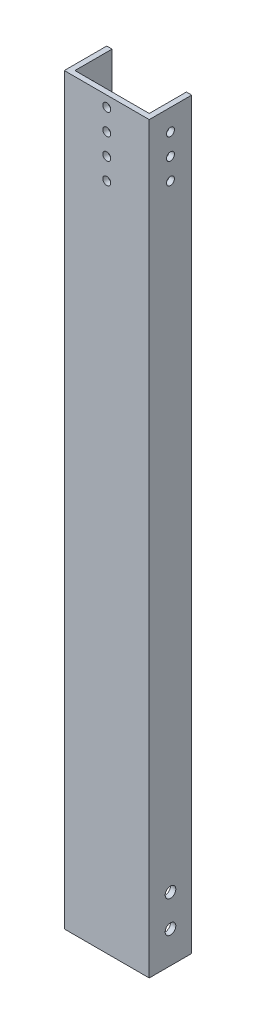
ISO-10303-21;
HEADER;
FILE_DESCRIPTION(('STEP AP214'),'2;1');
FILE_NAME('part.step','',(''),(''),'','','');
FILE_SCHEMA(('AUTOMOTIVE_DESIGN { 1 0 10303 214 1 1 1 1 }'));
ENDSEC;
DATA;
#1=APPLICATION_CONTEXT('core data for automotive mechanical design processes');
#2=APPLICATION_PROTOCOL_DEFINITION('international standard','automotive_design',2000,#1);
#3=PRODUCT_CONTEXT('',#1,'mechanical');
#4=PRODUCT('Part','Part','',(#3));
#5=PRODUCT_RELATED_PRODUCT_CATEGORY('part','',(#4));
#6=PRODUCT_DEFINITION_FORMATION('','',#4);
#7=PRODUCT_DEFINITION_CONTEXT('part definition',#1,'design');
#8=PRODUCT_DEFINITION('design','',#6,#7);
#9=PRODUCT_DEFINITION_SHAPE('','',#8);
#10=(LENGTH_UNIT() NAMED_UNIT(*) SI_UNIT(.MILLI.,.METRE.));
#11=(NAMED_UNIT(*) PLANE_ANGLE_UNIT() SI_UNIT($,.RADIAN.));
#12=(NAMED_UNIT(*) SI_UNIT($,.STERADIAN.) SOLID_ANGLE_UNIT());
#13=UNCERTAINTY_MEASURE_WITH_UNIT(LENGTH_MEASURE(1.E-05),#10,'distance_accuracy_value','');
#14=(GEOMETRIC_REPRESENTATION_CONTEXT(3) GLOBAL_UNCERTAINTY_ASSIGNED_CONTEXT((#13)) GLOBAL_UNIT_ASSIGNED_CONTEXT((#10,
#11,#12)) REPRESENTATION_CONTEXT('',''));
#15=CARTESIAN_POINT('',(0.,0.,0.));
#16=DIRECTION('',(0.,0.,1.));
#17=DIRECTION('',(1.,0.,0.));
#18=AXIS2_PLACEMENT_3D('',#15,#16,#17);
#19=CARTESIAN_POINT('',(0.,444.5,-25.4));
#20=DIRECTION('',(1.,0.,0.));
#21=DIRECTION('',(0.,0.,-1.));
#22=AXIS2_PLACEMENT_3D('',#19,#20,#21);
#23=PLANE('',#22);
#24=CARTESIAN_POINT('',(0.,431.8,-12.7));
#25=DIRECTION('',(1.,0.,0.));
#26=DIRECTION('',(0.,0.,-1.));
#27=AXIS2_PLACEMENT_3D('',#24,#25,#26);
#28=CIRCLE('',#27,2.38125000000006);
#29=CARTESIAN_POINT('',(0.,431.8,-15.0812500000001));
#30=VERTEX_POINT('',#29);
#31=EDGE_CURVE('E208',#30,#30,#28,.T.);
#32=ORIENTED_EDGE('',*,*,#31,.T.);
#33=EDGE_LOOP('',(#32));
#34=FACE_BOUND('',#33,.T.);
#35=CARTESIAN_POINT('',(0.,406.4,-12.7));
#36=DIRECTION('',(1.,0.,0.));
#37=DIRECTION('',(0.,0.,-1.));
#38=AXIS2_PLACEMENT_3D('',#35,#36,#37);
#39=CIRCLE('',#38,2.38125000000006);
#40=CARTESIAN_POINT('',(0.,406.4,-15.0812500000001));
#41=VERTEX_POINT('',#40);
#42=EDGE_CURVE('E201',#41,#41,#39,.T.);
#43=ORIENTED_EDGE('',*,*,#42,.T.);
#44=EDGE_LOOP('',(#43));
#45=FACE_BOUND('',#44,.T.);
#46=CARTESIAN_POINT('',(0.,419.1,-12.7));
#47=DIRECTION('',(1.,0.,0.));
#48=DIRECTION('',(0.,0.,-1.));
#49=AXIS2_PLACEMENT_3D('',#46,#47,#48);
#50=CIRCLE('',#49,2.38125000000006);
#51=CARTESIAN_POINT('',(0.,419.1,-15.0812500000001));
#52=VERTEX_POINT('',#51);
#53=EDGE_CURVE('E218',#52,#52,#50,.T.);
#54=ORIENTED_EDGE('',*,*,#53,.T.);
#55=EDGE_LOOP('',(#54));
#56=FACE_BOUND('',#55,.T.);
#57=CARTESIAN_POINT('',(0.,19.05,-12.7));
#58=DIRECTION('',(1.,0.,0.));
#59=DIRECTION('',(0.,0.,-1.));
#60=AXIS2_PLACEMENT_3D('',#57,#58,#59);
#61=CIRCLE('',#60,3.17500000000001);
#62=CARTESIAN_POINT('',(0.,19.05,-15.875));
#63=VERTEX_POINT('',#62);
#64=EDGE_CURVE('E165',#63,#63,#61,.T.);
#65=ORIENTED_EDGE('',*,*,#64,.T.);
#66=EDGE_LOOP('',(#65));
#67=FACE_BOUND('',#66,.T.);
#68=CARTESIAN_POINT('',(0.,38.1,-12.7));
#69=DIRECTION('',(1.,0.,0.));
#70=DIRECTION('',(0.,0.,-1.));
#71=AXIS2_PLACEMENT_3D('',#68,#69,#70);
#72=CIRCLE('',#71,3.175);
#73=CARTESIAN_POINT('',(0.,38.1,-15.875));
#74=VERTEX_POINT('',#73);
#75=EDGE_CURVE('E160',#74,#74,#72,.T.);
#76=ORIENTED_EDGE('',*,*,#75,.T.);
#77=EDGE_LOOP('',(#76));
#78=FACE_BOUND('',#77,.T.);
#79=DIRECTION('',(0.,0.,1.));
#80=VECTOR('',#79,1.);
#81=CARTESIAN_POINT('',(0.,0.,-25.4));
#82=LINE('',#81,#80);
#83=CARTESIAN_POINT('',(0.,0.,-25.4));
#84=VERTEX_POINT('',#83);
#85=CARTESIAN_POINT('',(0.,0.,0.));
#86=VERTEX_POINT('',#85);
#87=EDGE_CURVE('E130',#84,#86,#82,.T.);
#88=ORIENTED_EDGE('',*,*,#87,.T.);
#89=DIRECTION('',(0.,-1.,0.));
#90=VECTOR('',#89,1.);
#91=CARTESIAN_POINT('',(0.,444.5,0.));
#92=LINE('',#91,#90);
#93=CARTESIAN_POINT('',(0.,444.5,0.));
#94=VERTEX_POINT('',#93);
#95=EDGE_CURVE('E11',#94,#86,#92,.T.);
#96=ORIENTED_EDGE('',*,*,#95,.F.);
#97=DIRECTION('',(0.,0.,1.));
#98=VECTOR('',#97,1.);
#99=CARTESIAN_POINT('',(0.,444.5,-25.4));
#100=LINE('',#99,#98);
#101=CARTESIAN_POINT('',(0.,444.5,-25.4));
#102=VERTEX_POINT('',#101);
#103=EDGE_CURVE('E145',#102,#94,#100,.T.);
#104=ORIENTED_EDGE('',*,*,#103,.F.);
#105=DIRECTION('',(0.,-1.,0.));
#106=VECTOR('',#105,1.);
#107=CARTESIAN_POINT('',(0.,444.5,-25.4));
#108=LINE('',#107,#106);
#109=EDGE_CURVE('E126',#102,#84,#108,.T.);
#110=ORIENTED_EDGE('',*,*,#109,.T.);
#111=EDGE_LOOP('',(#88,#96,#104,#110));
#112=FACE_BOUND('',#111,.T.);
#113=ADVANCED_FACE('F32',(#34,#45,#56,#67,#78,#112),#23,.F.);
#114=CARTESIAN_POINT('',(0.,444.5,0.));
#115=DIRECTION('',(0.,0.,-1.));
#116=DIRECTION('',(-1.,0.,0.));
#117=AXIS2_PLACEMENT_3D('',#114,#115,#116);
#118=PLANE('',#117);
#119=CARTESIAN_POINT('',(25.4,425.45,0.));
#120=DIRECTION('',(0.,0.,1.));
#121=DIRECTION('',(1.,0.,0.));
#122=AXIS2_PLACEMENT_3D('',#119,#120,#121);
#123=CIRCLE('',#122,2.38125000000002);
#124=CARTESIAN_POINT('',(27.78125,425.45,0.));
#125=VERTEX_POINT('',#124);
#126=EDGE_CURVE('E186',#125,#125,#123,.T.);
#127=ORIENTED_EDGE('',*,*,#126,.F.);
#128=EDGE_LOOP('',(#127));
#129=FACE_BOUND('',#128,.T.);
#130=CARTESIAN_POINT('',(25.4,412.75,0.));
#131=DIRECTION('',(0.,0.,1.));
#132=DIRECTION('',(1.,0.,0.));
#133=AXIS2_PLACEMENT_3D('',#130,#131,#132);
#134=CIRCLE('',#133,2.38125000000002);
#135=CARTESIAN_POINT('',(27.78125,412.75,0.));
#136=VERTEX_POINT('',#135);
#137=EDGE_CURVE('E341',#136,#136,#134,.T.);
#138=ORIENTED_EDGE('',*,*,#137,.F.);
#139=EDGE_LOOP('',(#138));
#140=FACE_BOUND('',#139,.T.);
#141=CARTESIAN_POINT('',(25.4,400.05,0.));
#142=DIRECTION('',(0.,0.,1.));
#143=DIRECTION('',(1.,0.,0.));
#144=AXIS2_PLACEMENT_3D('',#141,#142,#143);
#145=CIRCLE('',#144,2.38125000000002);
#146=CARTESIAN_POINT('',(27.78125,400.05,0.));
#147=VERTEX_POINT('',#146);
#148=EDGE_CURVE('E199',#147,#147,#145,.T.);
#149=ORIENTED_EDGE('',*,*,#148,.F.);
#150=EDGE_LOOP('',(#149));
#151=FACE_BOUND('',#150,.T.);
#152=CARTESIAN_POINT('',(25.4,438.15,0.));
#153=DIRECTION('',(0.,0.,1.));
#154=DIRECTION('',(1.,0.,0.));
#155=AXIS2_PLACEMENT_3D('',#152,#153,#154);
#156=CIRCLE('',#155,2.38125000000002);
#157=CARTESIAN_POINT('',(27.78125,438.15,0.));
#158=VERTEX_POINT('',#157);
#159=EDGE_CURVE('E182',#158,#158,#156,.T.);
#160=ORIENTED_EDGE('',*,*,#159,.F.);
#161=EDGE_LOOP('',(#160));
#162=FACE_BOUND('',#161,.T.);
#163=DIRECTION('',(1.,0.,0.));
#164=VECTOR('',#163,1.);
#165=CARTESIAN_POINT('',(0.,0.,0.));
#166=LINE('',#165,#164);
#167=CARTESIAN_POINT('',(50.8,0.,0.));
#168=VERTEX_POINT('',#167);
#169=EDGE_CURVE('E133',#86,#168,#166,.T.);
#170=ORIENTED_EDGE('',*,*,#169,.T.);
#171=DIRECTION('',(0.,-1.,0.));
#172=VECTOR('',#171,1.);
#173=CARTESIAN_POINT('',(50.8,444.5,0.));
#174=LINE('',#173,#172);
#175=CARTESIAN_POINT('',(50.8,444.5,0.));
#176=VERTEX_POINT('',#175);
#177=EDGE_CURVE('E41',#176,#168,#174,.T.);
#178=ORIENTED_EDGE('',*,*,#177,.F.);
#179=DIRECTION('',(1.,0.,0.));
#180=VECTOR('',#179,1.);
#181=CARTESIAN_POINT('',(0.,444.5,0.));
#182=LINE('',#181,#180);
#183=EDGE_CURVE('E93',#94,#176,#182,.T.);
#184=ORIENTED_EDGE('',*,*,#183,.F.);
#185=ORIENTED_EDGE('',*,*,#95,.T.);
#186=EDGE_LOOP('',(#170,#178,#184,#185));
#187=FACE_BOUND('',#186,.T.);
#188=ADVANCED_FACE('F272',(#129,#140,#151,#162,#187),#118,.F.);
#189=CARTESIAN_POINT('',(50.8,444.5,0.));
#190=DIRECTION('',(-1.,0.,0.));
#191=DIRECTION('',(0.,0.,1.));
#192=AXIS2_PLACEMENT_3D('',#189,#190,#191);
#193=PLANE('',#192);
#194=CARTESIAN_POINT('',(50.8,431.8,-12.7));
#195=DIRECTION('',(1.,0.,0.));
#196=DIRECTION('',(0.,0.,-1.));
#197=AXIS2_PLACEMENT_3D('',#194,#195,#196);
#198=CIRCLE('',#197,2.38125000000006);
#199=CARTESIAN_POINT('',(50.8,431.8,-15.0812500000001));
#200=VERTEX_POINT('',#199);
#201=EDGE_CURVE('E181',#200,#200,#198,.T.);
#202=ORIENTED_EDGE('',*,*,#201,.F.);
#203=EDGE_LOOP('',(#202));
#204=FACE_BOUND('',#203,.T.);
#205=CARTESIAN_POINT('',(50.8,406.4,-12.7));
#206=DIRECTION('',(1.,0.,0.));
#207=DIRECTION('',(0.,0.,-1.));
#208=AXIS2_PLACEMENT_3D('',#205,#206,#207);
#209=CIRCLE('',#208,2.38125000000006);
#210=CARTESIAN_POINT('',(50.8,406.4,-15.0812500000001));
#211=VERTEX_POINT('',#210);
#212=EDGE_CURVE('E205',#211,#211,#209,.T.);
#213=ORIENTED_EDGE('',*,*,#212,.F.);
#214=EDGE_LOOP('',(#213));
#215=FACE_BOUND('',#214,.T.);
#216=CARTESIAN_POINT('',(50.8,419.1,-12.7));
#217=DIRECTION('',(1.,0.,0.));
#218=DIRECTION('',(0.,0.,-1.));
#219=AXIS2_PLACEMENT_3D('',#216,#217,#218);
#220=CIRCLE('',#219,2.38125000000006);
#221=CARTESIAN_POINT('',(50.8,419.1,-15.0812500000001));
#222=VERTEX_POINT('',#221);
#223=EDGE_CURVE('E204',#222,#222,#220,.T.);
#224=ORIENTED_EDGE('',*,*,#223,.F.);
#225=EDGE_LOOP('',(#224));
#226=FACE_BOUND('',#225,.T.);
#227=CARTESIAN_POINT('',(50.8,19.05,-12.7));
#228=DIRECTION('',(1.,0.,0.));
#229=DIRECTION('',(0.,0.,-1.));
#230=AXIS2_PLACEMENT_3D('',#227,#228,#229);
#231=CIRCLE('',#230,3.17500000000001);
#232=CARTESIAN_POINT('',(50.8,19.05,-15.875));
#233=VERTEX_POINT('',#232);
#234=EDGE_CURVE('E215',#233,#233,#231,.T.);
#235=ORIENTED_EDGE('',*,*,#234,.F.);
#236=EDGE_LOOP('',(#235));
#237=FACE_BOUND('',#236,.T.);
#238=CARTESIAN_POINT('',(50.8,38.1,-12.7));
#239=DIRECTION('',(1.,0.,0.));
#240=DIRECTION('',(0.,0.,-1.));
#241=AXIS2_PLACEMENT_3D('',#238,#239,#240);
#242=CIRCLE('',#241,3.175);
#243=CARTESIAN_POINT('',(50.8,38.1,-15.875));
#244=VERTEX_POINT('',#243);
#245=EDGE_CURVE('E231',#244,#244,#242,.T.);
#246=ORIENTED_EDGE('',*,*,#245,.F.);
#247=EDGE_LOOP('',(#246));
#248=FACE_BOUND('',#247,.T.);
#249=DIRECTION('',(0.,0.,-1.));
#250=VECTOR('',#249,1.);
#251=CARTESIAN_POINT('',(50.8,0.,0.));
#252=LINE('',#251,#250);
#253=CARTESIAN_POINT('',(50.8,0.,-25.4));
#254=VERTEX_POINT('',#253);
#255=EDGE_CURVE('E136',#168,#254,#252,.T.);
#256=ORIENTED_EDGE('',*,*,#255,.T.);
#257=DIRECTION('',(0.,-1.,0.));
#258=VECTOR('',#257,1.);
#259=CARTESIAN_POINT('',(50.8,444.5,-25.4));
#260=LINE('',#259,#258);
#261=CARTESIAN_POINT('',(50.8,444.5,-25.4));
#262=VERTEX_POINT('',#261);
#263=EDGE_CURVE('E152',#262,#254,#260,.T.);
#264=ORIENTED_EDGE('',*,*,#263,.F.);
#265=DIRECTION('',(0.,0.,-1.));
#266=VECTOR('',#265,1.);
#267=CARTESIAN_POINT('',(50.8,444.5,0.));
#268=LINE('',#267,#266);
#269=EDGE_CURVE('E240',#176,#262,#268,.T.);
#270=ORIENTED_EDGE('',*,*,#269,.F.);
#271=ORIENTED_EDGE('',*,*,#177,.T.);
#272=EDGE_LOOP('',(#256,#264,#270,#271));
#273=FACE_BOUND('',#272,.T.);
#274=ADVANCED_FACE('F277',(#204,#215,#226,#237,#248,#273),#193,.F.);
#275=CARTESIAN_POINT('',(50.8,444.5,-25.4));
#276=DIRECTION('',(0.,0.,1.));
#277=DIRECTION('',(1.,0.,0.));
#278=AXIS2_PLACEMENT_3D('',#275,#276,#277);
#279=PLANE('',#278);
#280=DIRECTION('',(-1.,0.,0.));
#281=VECTOR('',#280,1.);
#282=CARTESIAN_POINT('',(50.8,0.,-25.4));
#283=LINE('',#282,#281);
#284=CARTESIAN_POINT('',(47.625,0.,-25.4));
#285=VERTEX_POINT('',#284);
#286=EDGE_CURVE('E138',#254,#285,#283,.T.);
#287=ORIENTED_EDGE('',*,*,#286,.T.);
#288=DIRECTION('',(0.,-1.,0.));
#289=VECTOR('',#288,1.);
#290=CARTESIAN_POINT('',(47.625,444.5,-25.4));
#291=LINE('',#290,#289);
#292=CARTESIAN_POINT('',(47.625,444.5,-25.4));
#293=VERTEX_POINT('',#292);
#294=EDGE_CURVE('E149',#293,#285,#291,.T.);
#295=ORIENTED_EDGE('',*,*,#294,.F.);
#296=DIRECTION('',(-1.,0.,0.));
#297=VECTOR('',#296,1.);
#298=CARTESIAN_POINT('',(50.8,444.5,-25.4));
#299=LINE('',#298,#297);
#300=EDGE_CURVE('E242',#262,#293,#299,.T.);
#301=ORIENTED_EDGE('',*,*,#300,.F.);
#302=ORIENTED_EDGE('',*,*,#263,.T.);
#303=EDGE_LOOP('',(#287,#295,#301,#302));
#304=FACE_BOUND('',#303,.T.);
#305=ADVANCED_FACE('F248',(#304),#279,.F.);
#306=CARTESIAN_POINT('',(47.625,444.5,-25.4));
#307=DIRECTION('',(1.,0.,0.));
#308=DIRECTION('',(0.,0.,-1.));
#309=AXIS2_PLACEMENT_3D('',#306,#307,#308);
#310=PLANE('',#309);
#311=CARTESIAN_POINT('',(47.625,431.8,-12.7));
#312=DIRECTION('',(1.,0.,0.));
#313=DIRECTION('',(0.,0.,-1.));
#314=AXIS2_PLACEMENT_3D('',#311,#312,#313);
#315=CIRCLE('',#314,2.38125000000006);
#316=CARTESIAN_POINT('',(47.625,431.8,-15.0812500000001));
#317=VERTEX_POINT('',#316);
#318=EDGE_CURVE('E177',#317,#317,#315,.T.);
#319=ORIENTED_EDGE('',*,*,#318,.T.);
#320=EDGE_LOOP('',(#319));
#321=FACE_BOUND('',#320,.T.);
#322=CARTESIAN_POINT('',(47.625,406.4,-12.7));
#323=DIRECTION('',(1.,0.,0.));
#324=DIRECTION('',(0.,0.,-1.));
#325=AXIS2_PLACEMENT_3D('',#322,#323,#324);
#326=CIRCLE('',#325,2.38125000000006);
#327=CARTESIAN_POINT('',(47.625,406.4,-15.0812500000001));
#328=VERTEX_POINT('',#327);
#329=EDGE_CURVE('E173',#328,#328,#326,.T.);
#330=ORIENTED_EDGE('',*,*,#329,.T.);
#331=EDGE_LOOP('',(#330));
#332=FACE_BOUND('',#331,.T.);
#333=CARTESIAN_POINT('',(47.625,419.1,-12.7));
#334=DIRECTION('',(1.,0.,0.));
#335=DIRECTION('',(0.,0.,-1.));
#336=AXIS2_PLACEMENT_3D('',#333,#334,#335);
#337=CIRCLE('',#336,2.38125000000006);
#338=CARTESIAN_POINT('',(47.625,419.1,-15.0812500000001));
#339=VERTEX_POINT('',#338);
#340=EDGE_CURVE('E169',#339,#339,#337,.T.);
#341=ORIENTED_EDGE('',*,*,#340,.T.);
#342=EDGE_LOOP('',(#341));
#343=FACE_BOUND('',#342,.T.);
#344=CARTESIAN_POINT('',(47.625,19.05,-12.7));
#345=DIRECTION('',(1.,0.,0.));
#346=DIRECTION('',(0.,0.,-1.));
#347=AXIS2_PLACEMENT_3D('',#344,#345,#346);
#348=CIRCLE('',#347,3.17500000000001);
#349=CARTESIAN_POINT('',(47.625,19.05,-15.875));
#350=VERTEX_POINT('',#349);
#351=EDGE_CURVE('E164',#350,#350,#348,.T.);
#352=ORIENTED_EDGE('',*,*,#351,.T.);
#353=EDGE_LOOP('',(#352));
#354=FACE_BOUND('',#353,.T.);
#355=CARTESIAN_POINT('',(47.625,38.1,-12.7));
#356=DIRECTION('',(1.,0.,0.));
#357=DIRECTION('',(0.,0.,-1.));
#358=AXIS2_PLACEMENT_3D('',#355,#356,#357);
#359=CIRCLE('',#358,3.175);
#360=CARTESIAN_POINT('',(47.625,38.1,-15.875));
#361=VERTEX_POINT('',#360);
#362=EDGE_CURVE('E134',#361,#361,#359,.T.);
#363=ORIENTED_EDGE('',*,*,#362,.T.);
#364=EDGE_LOOP('',(#363));
#365=FACE_BOUND('',#364,.T.);
#366=DIRECTION('',(0.,0.,1.));
#367=VECTOR('',#366,1.);
#368=CARTESIAN_POINT('',(47.625,0.,-25.4));
#369=LINE('',#368,#367);
#370=CARTESIAN_POINT('',(47.625,0.,-3.175));
#371=VERTEX_POINT('',#370);
#372=EDGE_CURVE('E140',#285,#371,#369,.T.);
#373=ORIENTED_EDGE('',*,*,#372,.T.);
#374=DIRECTION('',(0.,-1.,0.));
#375=VECTOR('',#374,1.);
#376=CARTESIAN_POINT('',(47.625,444.5,-3.175));
#377=LINE('',#376,#375);
#378=CARTESIAN_POINT('',(47.625,444.5,-3.175));
#379=VERTEX_POINT('',#378);
#380=EDGE_CURVE('E121',#379,#371,#377,.T.);
#381=ORIENTED_EDGE('',*,*,#380,.F.);
#382=DIRECTION('',(0.,0.,1.));
#383=VECTOR('',#382,1.);
#384=CARTESIAN_POINT('',(47.625,444.5,-25.4));
#385=LINE('',#384,#383);
#386=EDGE_CURVE('E112',#293,#379,#385,.T.);
#387=ORIENTED_EDGE('',*,*,#386,.F.);
#388=ORIENTED_EDGE('',*,*,#294,.T.);
#389=EDGE_LOOP('',(#373,#381,#387,#388));
#390=FACE_BOUND('',#389,.T.);
#391=ADVANCED_FACE('F252',(#321,#332,#343,#354,#365,#390),#310,.F.);
#392=CARTESIAN_POINT('',(47.625,444.5,-3.175));
#393=DIRECTION('',(0.,0.,1.));
#394=DIRECTION('',(1.,0.,0.));
#395=AXIS2_PLACEMENT_3D('',#392,#393,#394);
#396=PLANE('',#395);
#397=CARTESIAN_POINT('',(25.4,425.45,-3.175));
#398=DIRECTION('',(0.,0.,1.));
#399=DIRECTION('',(1.,0.,0.));
#400=AXIS2_PLACEMENT_3D('',#397,#398,#399);
#401=CIRCLE('',#400,2.38125000000002);
#402=CARTESIAN_POINT('',(27.78125,425.45,-3.175));
#403=VERTEX_POINT('',#402);
#404=EDGE_CURVE('E35',#403,#403,#401,.T.);
#405=ORIENTED_EDGE('',*,*,#404,.T.);
#406=EDGE_LOOP('',(#405));
#407=FACE_BOUND('',#406,.T.);
#408=CARTESIAN_POINT('',(25.4,412.75,-3.175));
#409=DIRECTION('',(0.,0.,1.));
#410=DIRECTION('',(1.,0.,0.));
#411=AXIS2_PLACEMENT_3D('',#408,#409,#410);
#412=CIRCLE('',#411,2.38125000000002);
#413=CARTESIAN_POINT('',(27.78125,412.75,-3.175));
#414=VERTEX_POINT('',#413);
#415=EDGE_CURVE('E185',#414,#414,#412,.T.);
#416=ORIENTED_EDGE('',*,*,#415,.T.);
#417=EDGE_LOOP('',(#416));
#418=FACE_BOUND('',#417,.T.);
#419=CARTESIAN_POINT('',(25.4,400.05,-3.175));
#420=DIRECTION('',(0.,0.,1.));
#421=DIRECTION('',(1.,0.,0.));
#422=AXIS2_PLACEMENT_3D('',#419,#420,#421);
#423=CIRCLE('',#422,2.38125000000002);
#424=CARTESIAN_POINT('',(27.78125,400.05,-3.175));
#425=VERTEX_POINT('',#424);
#426=EDGE_CURVE('E183',#425,#425,#423,.T.);
#427=ORIENTED_EDGE('',*,*,#426,.T.);
#428=EDGE_LOOP('',(#427));
#429=FACE_BOUND('',#428,.T.);
#430=CARTESIAN_POINT('',(25.4,438.15,-3.175));
#431=DIRECTION('',(0.,0.,1.));
#432=DIRECTION('',(1.,0.,0.));
#433=AXIS2_PLACEMENT_3D('',#430,#431,#432);
#434=CIRCLE('',#433,2.38125000000002);
#435=CARTESIAN_POINT('',(27.78125,438.15,-3.175));
#436=VERTEX_POINT('',#435);
#437=EDGE_CURVE('E178',#436,#436,#434,.T.);
#438=ORIENTED_EDGE('',*,*,#437,.T.);
#439=EDGE_LOOP('',(#438));
#440=FACE_BOUND('',#439,.T.);
#441=DIRECTION('',(-1.,0.,0.));
#442=VECTOR('',#441,1.);
#443=CARTESIAN_POINT('',(47.625,0.,-3.175));
#444=LINE('',#443,#442);
#445=CARTESIAN_POINT('',(3.175,0.,-3.17499999999999));
#446=VERTEX_POINT('',#445);
#447=EDGE_CURVE('E120',#371,#446,#444,.T.);
#448=ORIENTED_EDGE('',*,*,#447,.T.);
#449=DIRECTION('',(0.,-1.,0.));
#450=VECTOR('',#449,1.);
#451=CARTESIAN_POINT('',(3.175,444.5,-3.17499999999999));
#452=LINE('',#451,#450);
#453=CARTESIAN_POINT('',(3.175,444.5,-3.17499999999999));
#454=VERTEX_POINT('',#453);
#455=EDGE_CURVE('E117',#454,#446,#452,.T.);
#456=ORIENTED_EDGE('',*,*,#455,.F.);
#457=DIRECTION('',(-1.,0.,0.));
#458=VECTOR('',#457,1.);
#459=CARTESIAN_POINT('',(47.625,444.5,-3.175));
#460=LINE('',#459,#458);
#461=EDGE_CURVE('E106',#379,#454,#460,.T.);
#462=ORIENTED_EDGE('',*,*,#461,.F.);
#463=ORIENTED_EDGE('',*,*,#380,.T.);
#464=EDGE_LOOP('',(#448,#456,#462,#463));
#465=FACE_BOUND('',#464,.T.);
#466=ADVANCED_FACE('F118',(#407,#418,#429,#440,#465),#396,.F.);
#467=CARTESIAN_POINT('',(3.175,444.5,-3.17499999999999));
#468=DIRECTION('',(-1.,0.,0.));
#469=DIRECTION('',(0.,0.,1.));
#470=AXIS2_PLACEMENT_3D('',#467,#468,#469);
#471=PLANE('',#470);
#472=CARTESIAN_POINT('',(3.175,431.8,-12.7));
#473=DIRECTION('',(-1.,0.,0.));
#474=DIRECTION('',(0.,0.,1.));
#475=AXIS2_PLACEMENT_3D('',#472,#473,#474);
#476=CIRCLE('',#475,2.38125000000006);
#477=CARTESIAN_POINT('',(3.175,431.8,-10.3187499999999));
#478=VERTEX_POINT('',#477);
#479=EDGE_CURVE('E174',#478,#478,#476,.T.);
#480=ORIENTED_EDGE('',*,*,#479,.T.);
#481=EDGE_LOOP('',(#480));
#482=FACE_BOUND('',#481,.T.);
#483=CARTESIAN_POINT('',(3.175,406.4,-12.7));
#484=DIRECTION('',(-1.,0.,0.));
#485=DIRECTION('',(0.,0.,1.));
#486=AXIS2_PLACEMENT_3D('',#483,#484,#485);
#487=CIRCLE('',#486,2.38125000000006);
#488=CARTESIAN_POINT('',(3.175,406.4,-10.31875));
#489=VERTEX_POINT('',#488);
#490=EDGE_CURVE('E170',#489,#489,#487,.T.);
#491=ORIENTED_EDGE('',*,*,#490,.T.);
#492=EDGE_LOOP('',(#491));
#493=FACE_BOUND('',#492,.T.);
#494=CARTESIAN_POINT('',(3.175,419.1,-12.7));
#495=DIRECTION('',(-1.,0.,0.));
#496=DIRECTION('',(0.,0.,1.));
#497=AXIS2_PLACEMENT_3D('',#494,#495,#496);
#498=CIRCLE('',#497,2.38125000000006);
#499=CARTESIAN_POINT('',(3.175,419.1,-10.3187499999999));
#500=VERTEX_POINT('',#499);
#501=EDGE_CURVE('E166',#500,#500,#498,.T.);
#502=ORIENTED_EDGE('',*,*,#501,.T.);
#503=EDGE_LOOP('',(#502));
#504=FACE_BOUND('',#503,.T.);
#505=CARTESIAN_POINT('',(3.175,19.05,-12.7));
#506=DIRECTION('',(-1.,0.,0.));
#507=DIRECTION('',(0.,0.,1.));
#508=AXIS2_PLACEMENT_3D('',#505,#506,#507);
#509=CIRCLE('',#508,3.17500000000001);
#510=CARTESIAN_POINT('',(3.175,19.05,-9.525));
#511=VERTEX_POINT('',#510);
#512=EDGE_CURVE('E161',#511,#511,#509,.T.);
#513=ORIENTED_EDGE('',*,*,#512,.T.);
#514=EDGE_LOOP('',(#513));
#515=FACE_BOUND('',#514,.T.);
#516=CARTESIAN_POINT('',(3.175,38.1,-12.7));
#517=DIRECTION('',(-1.,0.,0.));
#518=DIRECTION('',(0.,0.,1.));
#519=AXIS2_PLACEMENT_3D('',#516,#517,#518);
#520=CIRCLE('',#519,3.175);
#521=CARTESIAN_POINT('',(3.175,38.1,-9.52500000000001));
#522=VERTEX_POINT('',#521);
#523=EDGE_CURVE('E157',#522,#522,#520,.T.);
#524=ORIENTED_EDGE('',*,*,#523,.T.);
#525=EDGE_LOOP('',(#524));
#526=FACE_BOUND('',#525,.T.);
#527=DIRECTION('',(0.,0.,-1.));
#528=VECTOR('',#527,1.);
#529=CARTESIAN_POINT('',(3.175,0.,-3.17499999999999));
#530=LINE('',#529,#528);
#531=CARTESIAN_POINT('',(3.175,0.,-25.4));
#532=VERTEX_POINT('',#531);
#533=EDGE_CURVE('E79',#446,#532,#530,.T.);
#534=ORIENTED_EDGE('',*,*,#533,.T.);
#535=DIRECTION('',(0.,-1.,0.));
#536=VECTOR('',#535,1.);
#537=CARTESIAN_POINT('',(3.175,444.5,-25.4));
#538=LINE('',#537,#536);
#539=CARTESIAN_POINT('',(3.175,444.5,-25.4));
#540=VERTEX_POINT('',#539);
#541=EDGE_CURVE('E122',#540,#532,#538,.T.);
#542=ORIENTED_EDGE('',*,*,#541,.F.);
#543=DIRECTION('',(0.,0.,-1.));
#544=VECTOR('',#543,1.);
#545=CARTESIAN_POINT('',(3.175,444.5,-3.17499999999999));
#546=LINE('',#545,#544);
#547=EDGE_CURVE('E110',#454,#540,#546,.T.);
#548=ORIENTED_EDGE('',*,*,#547,.F.);
#549=ORIENTED_EDGE('',*,*,#455,.T.);
#550=EDGE_LOOP('',(#534,#542,#548,#549));
#551=FACE_BOUND('',#550,.T.);
#552=ADVANCED_FACE('F124',(#482,#493,#504,#515,#526,#551),#471,.F.);
#553=CARTESIAN_POINT('',(3.175,444.5,-25.4));
#554=DIRECTION('',(0.,0.,1.));
#555=DIRECTION('',(1.,0.,0.));
#556=AXIS2_PLACEMENT_3D('',#553,#554,#555);
#557=PLANE('',#556);
#558=DIRECTION('',(-1.,0.,0.));
#559=VECTOR('',#558,1.);
#560=CARTESIAN_POINT('',(3.175,0.,-25.4));
#561=LINE('',#560,#559);
#562=EDGE_CURVE('E85',#532,#84,#561,.T.);
#563=ORIENTED_EDGE('',*,*,#562,.T.);
#564=ORIENTED_EDGE('',*,*,#109,.F.);
#565=DIRECTION('',(-1.,0.,0.));
#566=VECTOR('',#565,1.);
#567=CARTESIAN_POINT('',(3.175,444.5,-25.4));
#568=LINE('',#567,#566);
#569=EDGE_CURVE('E50',#540,#102,#568,.T.);
#570=ORIENTED_EDGE('',*,*,#569,.F.);
#571=ORIENTED_EDGE('',*,*,#541,.T.);
#572=EDGE_LOOP('',(#563,#564,#570,#571));
#573=FACE_BOUND('',#572,.T.);
#574=ADVANCED_FACE('F260',(#573),#557,.F.);
#575=CARTESIAN_POINT('',(0.,444.5,0.));
#576=DIRECTION('',(0.,1.,0.));
#577=DIRECTION('',(0.,0.,1.));
#578=AXIS2_PLACEMENT_3D('',#575,#576,#577);
#579=PLANE('',#578);
#580=ORIENTED_EDGE('',*,*,#103,.T.);
#581=ORIENTED_EDGE('',*,*,#183,.T.);
#582=ORIENTED_EDGE('',*,*,#269,.T.);
#583=ORIENTED_EDGE('',*,*,#300,.T.);
#584=ORIENTED_EDGE('',*,*,#386,.T.);
#585=ORIENTED_EDGE('',*,*,#461,.T.);
#586=ORIENTED_EDGE('',*,*,#547,.T.);
#587=ORIENTED_EDGE('',*,*,#569,.T.);
#588=EDGE_LOOP('',(#580,#581,#582,#583,#584,#585,#586,#587));
#589=FACE_BOUND('',#588,.T.);
#590=ADVANCED_FACE('F108',(#589),#579,.T.);
#591=CARTESIAN_POINT('',(0.,0.,0.));
#592=DIRECTION('',(0.,1.,0.));
#593=DIRECTION('',(0.,0.,1.));
#594=AXIS2_PLACEMENT_3D('',#591,#592,#593);
#595=PLANE('',#594);
#596=ORIENTED_EDGE('',*,*,#87,.F.);
#597=ORIENTED_EDGE('',*,*,#562,.F.);
#598=ORIENTED_EDGE('',*,*,#533,.F.);
#599=ORIENTED_EDGE('',*,*,#447,.F.);
#600=ORIENTED_EDGE('',*,*,#372,.F.);
#601=ORIENTED_EDGE('',*,*,#286,.F.);
#602=ORIENTED_EDGE('',*,*,#255,.F.);
#603=ORIENTED_EDGE('',*,*,#169,.F.);
#604=EDGE_LOOP('',(#596,#597,#598,#599,#600,#601,#602,#603));
#605=FACE_BOUND('',#604,.T.);
#606=ADVANCED_FACE('F255',(#605),#595,.F.);
#607=CARTESIAN_POINT('',(0.,38.1,-12.7));
#608=DIRECTION('',(1.,0.,0.));
#609=DIRECTION('',(0.,0.,-1.));
#610=AXIS2_PLACEMENT_3D('',#607,#608,#609);
#611=CYLINDRICAL_SURFACE('',#610,3.175);
#612=ORIENTED_EDGE('',*,*,#75,.F.);
#613=EDGE_LOOP('',(#612));
#614=FACE_BOUND('',#613,.T.);
#615=ORIENTED_EDGE('',*,*,#523,.F.);
#616=EDGE_LOOP('',(#615));
#617=FACE_BOUND('',#616,.T.);
#618=ADVANCED_FACE('F289',(#614,#617),#611,.F.);
#619=ORIENTED_EDGE('',*,*,#245,.T.);
#620=EDGE_LOOP('',(#619));
#621=FACE_BOUND('',#620,.T.);
#622=ORIENTED_EDGE('',*,*,#362,.F.);
#623=EDGE_LOOP('',(#622));
#624=FACE_BOUND('',#623,.T.);
#625=ADVANCED_FACE('F292',(#621,#624),#611,.F.);
#626=CARTESIAN_POINT('',(0.,19.05,-12.7));
#627=DIRECTION('',(1.,0.,0.));
#628=DIRECTION('',(0.,0.,-1.));
#629=AXIS2_PLACEMENT_3D('',#626,#627,#628);
#630=CYLINDRICAL_SURFACE('',#629,3.17500000000001);
#631=ORIENTED_EDGE('',*,*,#64,.F.);
#632=EDGE_LOOP('',(#631));
#633=FACE_BOUND('',#632,.T.);
#634=ORIENTED_EDGE('',*,*,#512,.F.);
#635=EDGE_LOOP('',(#634));
#636=FACE_BOUND('',#635,.T.);
#637=ADVANCED_FACE('F300',(#633,#636),#630,.F.);
#638=CARTESIAN_POINT('',(0.,419.1,-12.7));
#639=DIRECTION('',(1.,0.,0.));
#640=DIRECTION('',(0.,0.,-1.));
#641=AXIS2_PLACEMENT_3D('',#638,#639,#640);
#642=CYLINDRICAL_SURFACE('',#641,2.38125000000006);
#643=ORIENTED_EDGE('',*,*,#53,.F.);
#644=EDGE_LOOP('',(#643));
#645=FACE_BOUND('',#644,.T.);
#646=ORIENTED_EDGE('',*,*,#501,.F.);
#647=EDGE_LOOP('',(#646));
#648=FACE_BOUND('',#647,.T.);
#649=ADVANCED_FACE('F309',(#645,#648),#642,.F.);
#650=CARTESIAN_POINT('',(0.,406.4,-12.7));
#651=DIRECTION('',(1.,0.,0.));
#652=DIRECTION('',(0.,0.,-1.));
#653=AXIS2_PLACEMENT_3D('',#650,#651,#652);
#654=CYLINDRICAL_SURFACE('',#653,2.38125000000006);
#655=ORIENTED_EDGE('',*,*,#42,.F.);
#656=EDGE_LOOP('',(#655));
#657=FACE_BOUND('',#656,.T.);
#658=ORIENTED_EDGE('',*,*,#490,.F.);
#659=EDGE_LOOP('',(#658));
#660=FACE_BOUND('',#659,.T.);
#661=ADVANCED_FACE('F322',(#657,#660),#654,.F.);
#662=CARTESIAN_POINT('',(0.,431.8,-12.7));
#663=DIRECTION('',(1.,0.,0.));
#664=DIRECTION('',(0.,0.,-1.));
#665=AXIS2_PLACEMENT_3D('',#662,#663,#664);
#666=CYLINDRICAL_SURFACE('',#665,2.38125000000006);
#667=ORIENTED_EDGE('',*,*,#31,.F.);
#668=EDGE_LOOP('',(#667));
#669=FACE_BOUND('',#668,.T.);
#670=ORIENTED_EDGE('',*,*,#479,.F.);
#671=EDGE_LOOP('',(#670));
#672=FACE_BOUND('',#671,.T.);
#673=ADVANCED_FACE('F312',(#669,#672),#666,.F.);
#674=ORIENTED_EDGE('',*,*,#234,.T.);
#675=EDGE_LOOP('',(#674));
#676=FACE_BOUND('',#675,.T.);
#677=ORIENTED_EDGE('',*,*,#351,.F.);
#678=EDGE_LOOP('',(#677));
#679=FACE_BOUND('',#678,.T.);
#680=ADVANCED_FACE('F307',(#676,#679),#630,.F.);
#681=ORIENTED_EDGE('',*,*,#223,.T.);
#682=EDGE_LOOP('',(#681));
#683=FACE_BOUND('',#682,.T.);
#684=ORIENTED_EDGE('',*,*,#340,.F.);
#685=EDGE_LOOP('',(#684));
#686=FACE_BOUND('',#685,.T.);
#687=ADVANCED_FACE('F303',(#683,#686),#642,.F.);
#688=ORIENTED_EDGE('',*,*,#212,.T.);
#689=EDGE_LOOP('',(#688));
#690=FACE_BOUND('',#689,.T.);
#691=ORIENTED_EDGE('',*,*,#329,.F.);
#692=EDGE_LOOP('',(#691));
#693=FACE_BOUND('',#692,.T.);
#694=ADVANCED_FACE('F306',(#690,#693),#654,.F.);
#695=ORIENTED_EDGE('',*,*,#201,.T.);
#696=EDGE_LOOP('',(#695));
#697=FACE_BOUND('',#696,.T.);
#698=ORIENTED_EDGE('',*,*,#318,.F.);
#699=EDGE_LOOP('',(#698));
#700=FACE_BOUND('',#699,.T.);
#701=ADVANCED_FACE('F314',(#697,#700),#666,.F.);
#702=CARTESIAN_POINT('',(25.4,438.15,-25.4));
#703=DIRECTION('',(0.,0.,1.));
#704=DIRECTION('',(1.,0.,0.));
#705=AXIS2_PLACEMENT_3D('',#702,#703,#704);
#706=CYLINDRICAL_SURFACE('',#705,2.38125000000002);
#707=ORIENTED_EDGE('',*,*,#159,.T.);
#708=EDGE_LOOP('',(#707));
#709=FACE_BOUND('',#708,.T.);
#710=ORIENTED_EDGE('',*,*,#437,.F.);
#711=EDGE_LOOP('',(#710));
#712=FACE_BOUND('',#711,.T.);
#713=ADVANCED_FACE('F317',(#709,#712),#706,.F.);
#714=CARTESIAN_POINT('',(25.4,400.05,-25.4));
#715=DIRECTION('',(0.,0.,1.));
#716=DIRECTION('',(1.,0.,0.));
#717=AXIS2_PLACEMENT_3D('',#714,#715,#716);
#718=CYLINDRICAL_SURFACE('',#717,2.38125000000002);
#719=ORIENTED_EDGE('',*,*,#148,.T.);
#720=EDGE_LOOP('',(#719));
#721=FACE_BOUND('',#720,.T.);
#722=ORIENTED_EDGE('',*,*,#426,.F.);
#723=EDGE_LOOP('',(#722));
#724=FACE_BOUND('',#723,.T.);
#725=ADVANCED_FACE('F325',(#721,#724),#718,.F.);
#726=CARTESIAN_POINT('',(25.4,412.75,-25.4));
#727=DIRECTION('',(0.,0.,1.));
#728=DIRECTION('',(1.,0.,0.));
#729=AXIS2_PLACEMENT_3D('',#726,#727,#728);
#730=CYLINDRICAL_SURFACE('',#729,2.38125000000002);
#731=ORIENTED_EDGE('',*,*,#137,.T.);
#732=EDGE_LOOP('',(#731));
#733=FACE_BOUND('',#732,.T.);
#734=ORIENTED_EDGE('',*,*,#415,.F.);
#735=EDGE_LOOP('',(#734));
#736=FACE_BOUND('',#735,.T.);
#737=ADVANCED_FACE('F328',(#733,#736),#730,.F.);
#738=CARTESIAN_POINT('',(25.4,425.45,-25.4));
#739=DIRECTION('',(0.,0.,1.));
#740=DIRECTION('',(1.,0.,0.));
#741=AXIS2_PLACEMENT_3D('',#738,#739,#740);
#742=CYLINDRICAL_SURFACE('',#741,2.38125000000002);
#743=ORIENTED_EDGE('',*,*,#126,.T.);
#744=EDGE_LOOP('',(#743));
#745=FACE_BOUND('',#744,.T.);
#746=ORIENTED_EDGE('',*,*,#404,.F.);
#747=EDGE_LOOP('',(#746));
#748=FACE_BOUND('',#747,.T.);
#749=ADVANCED_FACE('F332',(#745,#748),#742,.F.);
#750=CLOSED_SHELL('',(#113,#188,#274,#305,#391,#466,#552,#574,#590,#606,#618,#625,#637,#649,
#661,#673,#680,#687,#694,#701,#713,#725,#737,#749));
#751=MANIFOLD_SOLID_BREP('B2',#750);
#752=ADVANCED_BREP_SHAPE_REPRESENTATION('',(#18,#751),#14);
#753=SHAPE_DEFINITION_REPRESENTATION(#9,#752);
ENDSEC;
END-ISO-10303-21;
